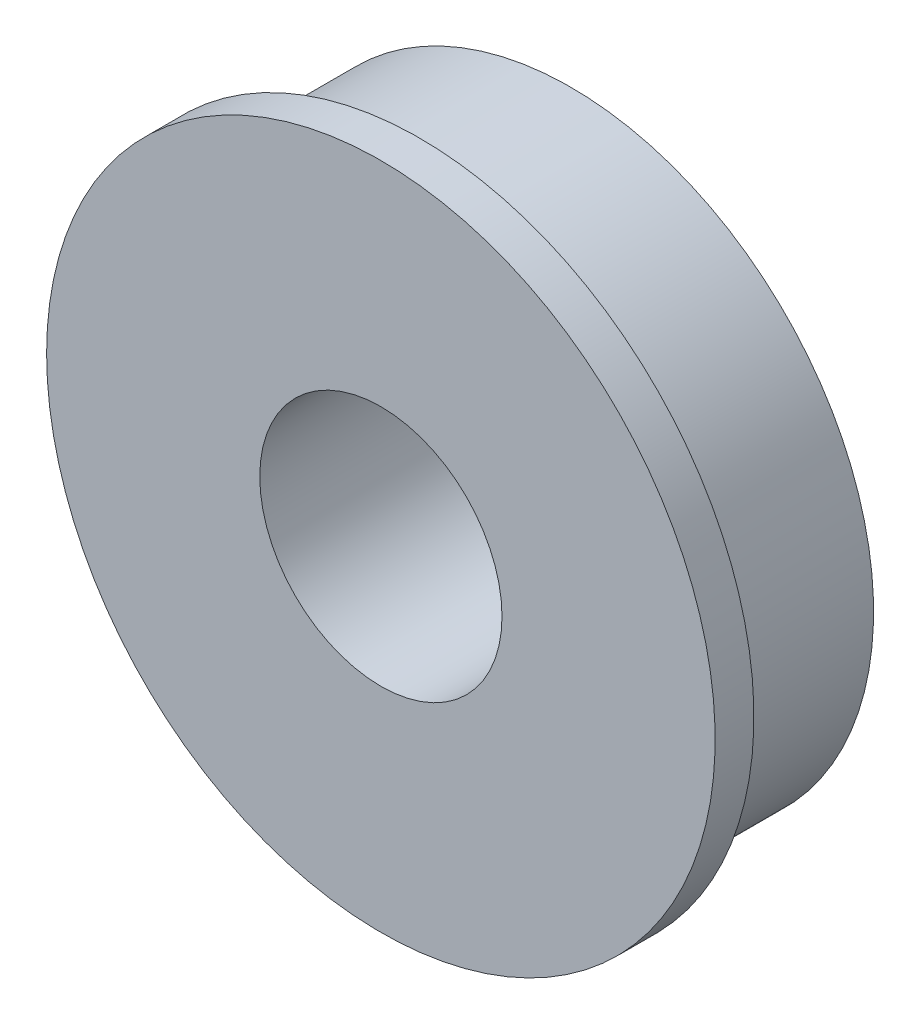
ISO-10303-21;
HEADER;
FILE_DESCRIPTION(('STEP AP214'),'2;1');
FILE_NAME('part.step','',(''),(''),'','','');
FILE_SCHEMA(('AUTOMOTIVE_DESIGN { 1 0 10303 214 1 1 1 1 }'));
ENDSEC;
DATA;
#1=APPLICATION_CONTEXT('core data for automotive mechanical design processes');
#2=APPLICATION_PROTOCOL_DEFINITION('international standard','automotive_design',2000,#1);
#3=PRODUCT_CONTEXT('',#1,'mechanical');
#4=PRODUCT('Part','Part','',(#3));
#5=PRODUCT_RELATED_PRODUCT_CATEGORY('part','',(#4));
#6=PRODUCT_DEFINITION_FORMATION('','',#4);
#7=PRODUCT_DEFINITION_CONTEXT('part definition',#1,'design');
#8=PRODUCT_DEFINITION('design','',#6,#7);
#9=PRODUCT_DEFINITION_SHAPE('','',#8);
#10=(LENGTH_UNIT() NAMED_UNIT(*) SI_UNIT(.MILLI.,.METRE.));
#11=(NAMED_UNIT(*) PLANE_ANGLE_UNIT() SI_UNIT($,.RADIAN.));
#12=(NAMED_UNIT(*) SI_UNIT($,.STERADIAN.) SOLID_ANGLE_UNIT());
#13=UNCERTAINTY_MEASURE_WITH_UNIT(LENGTH_MEASURE(1.E-05),#10,'distance_accuracy_value','');
#14=(GEOMETRIC_REPRESENTATION_CONTEXT(3) GLOBAL_UNCERTAINTY_ASSIGNED_CONTEXT((#13)) GLOBAL_UNIT_ASSIGNED_CONTEXT((#10,
#11,#12)) REPRESENTATION_CONTEXT('',''));
#15=CARTESIAN_POINT('',(0.,0.,0.));
#16=DIRECTION('',(0.,0.,1.));
#17=DIRECTION('',(1.,0.,0.));
#18=AXIS2_PLACEMENT_3D('',#15,#16,#17);
#19=CARTESIAN_POINT('',(-35.5331378268646,0.,-99.0018036822282));
#20=DIRECTION('',(0.,0.,-1.));
#21=DIRECTION('',(-1.,0.,0.));
#22=AXIS2_PLACEMENT_3D('',#19,#20,#21);
#23=CYLINDRICAL_SURFACE('',#22,8.76299999999999);
#24=CARTESIAN_POINT('',(-35.5331378268646,0.,-94.0234036822282));
#25=DIRECTION('',(0.,0.,-1.));
#26=DIRECTION('',(-1.,0.,0.));
#27=AXIS2_PLACEMENT_3D('',#24,#25,#26);
#28=CIRCLE('',#27,8.76299999999999);
#29=CARTESIAN_POINT('',(-44.2961378268646,0.,-94.0234036822282));
#30=VERTEX_POINT('',#29);
#31=EDGE_CURVE('E10',#30,#30,#28,.T.);
#32=ORIENTED_EDGE('',*,*,#31,.T.);
#33=EDGE_LOOP('',(#32));
#34=FACE_BOUND('',#33,.T.);
#35=CARTESIAN_POINT('',(-35.5331378268646,0.,-95.0394036822282));
#36=DIRECTION('',(0.,0.,-1.));
#37=DIRECTION('',(-1.,0.,0.));
#38=AXIS2_PLACEMENT_3D('',#35,#36,#37);
#39=CIRCLE('',#38,8.76299999999999);
#40=CARTESIAN_POINT('',(-44.2961378268646,0.,-95.0394036822282));
#41=VERTEX_POINT('',#40);
#42=EDGE_CURVE('E55',#41,#41,#39,.T.);
#43=ORIENTED_EDGE('',*,*,#42,.F.);
#44=EDGE_LOOP('',(#43));
#45=FACE_BOUND('',#44,.T.);
#46=ADVANCED_FACE('F33',(#34,#45),#23,.T.);
#47=CARTESIAN_POINT('',(0.,0.,-94.0234036822282));
#48=DIRECTION('',(0.,0.,1.));
#49=DIRECTION('',(1.,0.,0.));
#50=AXIS2_PLACEMENT_3D('',#47,#48,#49);
#51=PLANE('',#50);
#52=CARTESIAN_POINT('',(-35.5331378268646,0.,-94.0234036822282));
#53=DIRECTION('',(0.,0.,-1.));
#54=DIRECTION('',(-1.,0.,0.));
#55=AXIS2_PLACEMENT_3D('',#52,#53,#54);
#56=CIRCLE('',#55,3.175);
#57=CARTESIAN_POINT('',(-38.7081378268646,0.,-94.0234036822282));
#58=VERTEX_POINT('',#57);
#59=EDGE_CURVE('E39',#58,#58,#56,.T.);
#60=ORIENTED_EDGE('',*,*,#59,.T.);
#61=EDGE_LOOP('',(#60));
#62=FACE_BOUND('',#61,.T.);
#63=ORIENTED_EDGE('',*,*,#31,.F.);
#64=EDGE_LOOP('',(#63));
#65=FACE_BOUND('',#64,.T.);
#66=ADVANCED_FACE('F62',(#62,#65),#51,.T.);
#67=CARTESIAN_POINT('',(-35.5331378268646,0.,-99.0018036822282));
#68=DIRECTION('',(0.,0.,-1.));
#69=DIRECTION('',(-1.,0.,0.));
#70=AXIS2_PLACEMENT_3D('',#67,#68,#69);
#71=CYLINDRICAL_SURFACE('',#70,3.175);
#72=CARTESIAN_POINT('',(-35.5331378268646,0.,-99.0018036822282));
#73=DIRECTION('',(0.,0.,-1.));
#74=DIRECTION('',(-1.,0.,0.));
#75=AXIS2_PLACEMENT_3D('',#72,#73,#74);
#76=CIRCLE('',#75,3.175);
#77=CARTESIAN_POINT('',(-38.7081378268646,0.,-99.0018036822282));
#78=VERTEX_POINT('',#77);
#79=EDGE_CURVE('E43',#78,#78,#76,.T.);
#80=ORIENTED_EDGE('',*,*,#79,.T.);
#81=EDGE_LOOP('',(#80));
#82=FACE_BOUND('',#81,.T.);
#83=ORIENTED_EDGE('',*,*,#59,.F.);
#84=EDGE_LOOP('',(#83));
#85=FACE_BOUND('',#84,.T.);
#86=ADVANCED_FACE('F66',(#82,#85),#71,.F.);
#87=CARTESIAN_POINT('',(2.88488404009E-13,0.,-99.0018036822282));
#88=DIRECTION('',(0.,0.,1.));
#89=DIRECTION('',(1.,0.,0.));
#90=AXIS2_PLACEMENT_3D('',#87,#88,#89);
#91=PLANE('',#90);
#92=ORIENTED_EDGE('',*,*,#79,.F.);
#93=EDGE_LOOP('',(#92));
#94=FACE_BOUND('',#93,.T.);
#95=CARTESIAN_POINT('',(-35.5331378268646,0.,-99.0018036822282));
#96=DIRECTION('',(0.,0.,-1.));
#97=DIRECTION('',(-1.,0.,0.));
#98=AXIS2_PLACEMENT_3D('',#95,#96,#97);
#99=CIRCLE('',#98,7.9375);
#100=CARTESIAN_POINT('',(-43.4706378268646,0.,-99.0018036822282));
#101=VERTEX_POINT('',#100);
#102=EDGE_CURVE('E47',#101,#101,#99,.T.);
#103=ORIENTED_EDGE('',*,*,#102,.T.);
#104=EDGE_LOOP('',(#103));
#105=FACE_BOUND('',#104,.T.);
#106=ADVANCED_FACE('F70',(#94,#105),#91,.F.);
#107=CARTESIAN_POINT('',(-35.5331378268646,0.,-99.0018036822282));
#108=DIRECTION('',(0.,0.,-1.));
#109=DIRECTION('',(-1.,0.,0.));
#110=AXIS2_PLACEMENT_3D('',#107,#108,#109);
#111=CYLINDRICAL_SURFACE('',#110,7.9375);
#112=ORIENTED_EDGE('',*,*,#102,.F.);
#113=EDGE_LOOP('',(#112));
#114=FACE_BOUND('',#113,.T.);
#115=CARTESIAN_POINT('',(-35.5331378268646,0.,-95.0394036822282));
#116=DIRECTION('',(0.,0.,-1.));
#117=DIRECTION('',(-1.,0.,0.));
#118=AXIS2_PLACEMENT_3D('',#115,#116,#117);
#119=CIRCLE('',#118,7.9375);
#120=CARTESIAN_POINT('',(-43.4706378268646,0.,-95.0394036822282));
#121=VERTEX_POINT('',#120);
#122=EDGE_CURVE('E52',#121,#121,#119,.T.);
#123=ORIENTED_EDGE('',*,*,#122,.T.);
#124=EDGE_LOOP('',(#123));
#125=FACE_BOUND('',#124,.T.);
#126=ADVANCED_FACE('F77',(#114,#125),#111,.T.);
#127=CARTESIAN_POINT('',(0.,0.,-95.0394036822282));
#128=DIRECTION('',(0.,0.,1.));
#129=DIRECTION('',(1.,0.,0.));
#130=AXIS2_PLACEMENT_3D('',#127,#128,#129);
#131=PLANE('',#130);
#132=ORIENTED_EDGE('',*,*,#122,.F.);
#133=EDGE_LOOP('',(#132));
#134=FACE_BOUND('',#133,.T.);
#135=ORIENTED_EDGE('',*,*,#42,.T.);
#136=EDGE_LOOP('',(#135));
#137=FACE_BOUND('',#136,.T.);
#138=ADVANCED_FACE('F59',(#134,#137),#131,.F.);
#139=CLOSED_SHELL('',(#46,#66,#86,#106,#126,#138));
#140=MANIFOLD_SOLID_BREP('B2',#139);
#141=ADVANCED_BREP_SHAPE_REPRESENTATION('',(#18,#140),#14);
#142=SHAPE_DEFINITION_REPRESENTATION(#9,#141);
ENDSEC;
END-ISO-10303-21;
